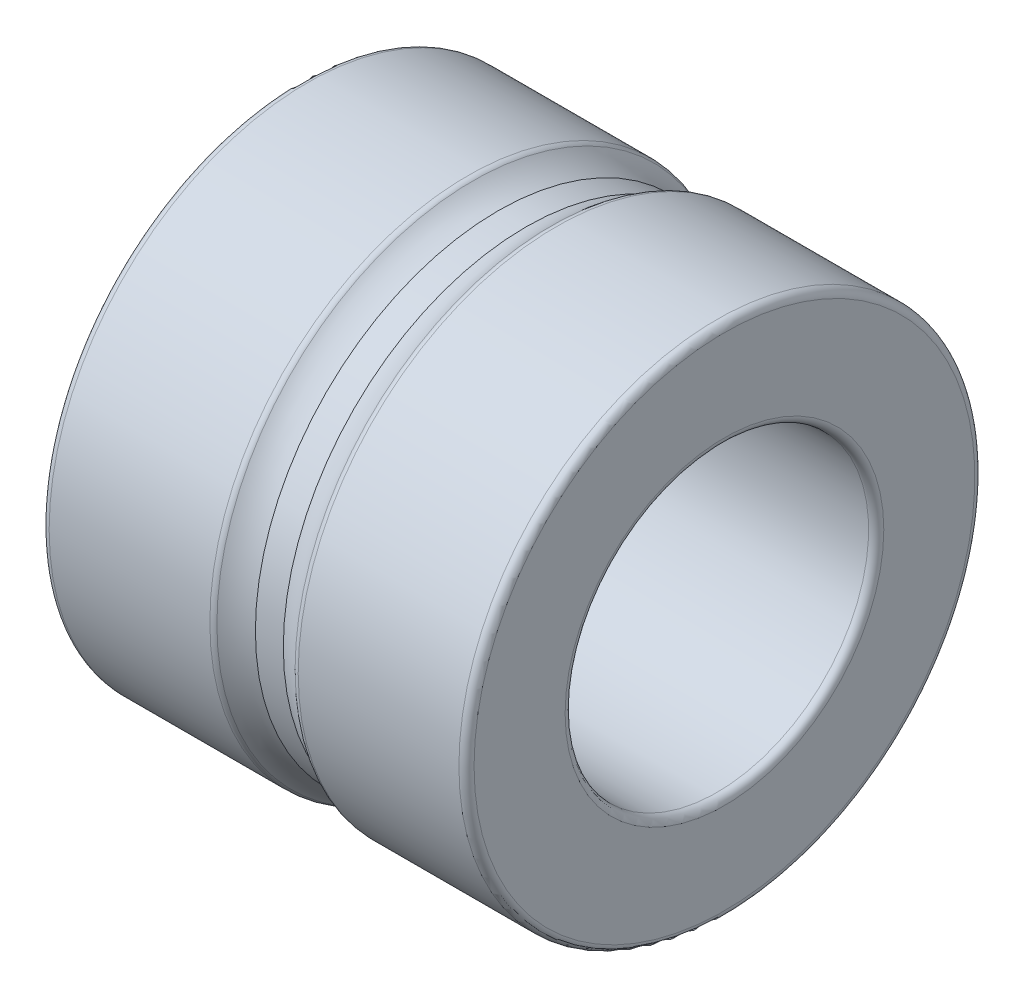
ISO-10303-21;
HEADER;
FILE_DESCRIPTION(('STEP AP214'),'2;1');
FILE_NAME('part.step','',(''),(''),'','','');
FILE_SCHEMA(('AUTOMOTIVE_DESIGN { 1 0 10303 214 1 1 1 1 }'));
ENDSEC;
DATA;
#1=APPLICATION_CONTEXT('core data for automotive mechanical design processes');
#2=APPLICATION_PROTOCOL_DEFINITION('international standard','automotive_design',2000,#1);
#3=PRODUCT_CONTEXT('',#1,'mechanical');
#4=PRODUCT('Part','Part','',(#3));
#5=PRODUCT_RELATED_PRODUCT_CATEGORY('part','',(#4));
#6=PRODUCT_DEFINITION_FORMATION('','',#4);
#7=PRODUCT_DEFINITION_CONTEXT('part definition',#1,'design');
#8=PRODUCT_DEFINITION('design','',#6,#7);
#9=PRODUCT_DEFINITION_SHAPE('','',#8);
#10=(LENGTH_UNIT() NAMED_UNIT(*) SI_UNIT(.MILLI.,.METRE.));
#11=(NAMED_UNIT(*) PLANE_ANGLE_UNIT() SI_UNIT($,.RADIAN.));
#12=(NAMED_UNIT(*) SI_UNIT($,.STERADIAN.) SOLID_ANGLE_UNIT());
#13=UNCERTAINTY_MEASURE_WITH_UNIT(LENGTH_MEASURE(1.E-05),#10,'distance_accuracy_value','');
#14=(GEOMETRIC_REPRESENTATION_CONTEXT(3) GLOBAL_UNCERTAINTY_ASSIGNED_CONTEXT((#13)) GLOBAL_UNIT_ASSIGNED_CONTEXT((#10,
#11,#12)) REPRESENTATION_CONTEXT('',''));
#15=CARTESIAN_POINT('',(0.,0.,0.));
#16=DIRECTION('',(0.,0.,1.));
#17=DIRECTION('',(1.,0.,0.));
#18=AXIS2_PLACEMENT_3D('',#15,#16,#17);
#19=CARTESIAN_POINT('',(0.,5.,0.));
#20=DIRECTION('',(1.,0.,0.));
#21=DIRECTION('',(0.,0.,-1.));
#22=AXIS2_PLACEMENT_3D('',#19,#20,#21);
#23=PLANE('',#22);
#24=CARTESIAN_POINT('',(0.,0.,0.));
#25=DIRECTION('',(1.,0.,0.));
#26=DIRECTION('',(0.,0.,-1.));
#27=AXIS2_PLACEMENT_3D('',#24,#25,#26);
#28=CIRCLE('',#27,5.25);
#29=CARTESIAN_POINT('',(0.,0.,-5.25));
#30=VERTEX_POINT('',#29);
#31=EDGE_CURVE('E49',#30,#30,#28,.T.);
#32=ORIENTED_EDGE('',*,*,#31,.T.);
#33=EDGE_LOOP('',(#32));
#34=FACE_BOUND('',#33,.T.);
#35=CARTESIAN_POINT('',(0.,0.,0.));
#36=DIRECTION('',(1.,0.,0.));
#37=DIRECTION('',(0.,0.,-1.));
#38=AXIS2_PLACEMENT_3D('',#35,#36,#37);
#39=CIRCLE('',#38,8.25);
#40=CARTESIAN_POINT('',(0.,0.,-8.25));
#41=VERTEX_POINT('',#40);
#42=EDGE_CURVE('E54',#41,#41,#39,.F.);
#43=ORIENTED_EDGE('',*,*,#42,.T.);
#44=EDGE_LOOP('',(#43));
#45=FACE_BOUND('',#44,.T.);
#46=ADVANCED_FACE('F36',(#34,#45),#23,.F.);
#47=CARTESIAN_POINT('',(0.,0.,0.));
#48=DIRECTION('',(-1.,0.,0.));
#49=DIRECTION('',(0.,0.,1.));
#50=AXIS2_PLACEMENT_3D('',#47,#48,#49);
#51=CYLINDRICAL_SURFACE('',#50,5.);
#52=CARTESIAN_POINT('',(0.25,0.,0.));
#53=DIRECTION('',(1.,0.,0.));
#54=DIRECTION('',(0.,0.,-1.));
#55=AXIS2_PLACEMENT_3D('',#52,#53,#54);
#56=CIRCLE('',#55,5.);
#57=CARTESIAN_POINT('',(0.25,0.,-5.));
#58=VERTEX_POINT('',#57);
#59=EDGE_CURVE('E60',#58,#58,#56,.F.);
#60=ORIENTED_EDGE('',*,*,#59,.T.);
#61=EDGE_LOOP('',(#60));
#62=FACE_BOUND('',#61,.T.);
#63=CARTESIAN_POINT('',(13.75,0.,0.));
#64=DIRECTION('',(-1.,0.,0.));
#65=DIRECTION('',(0.,0.,1.));
#66=AXIS2_PLACEMENT_3D('',#63,#64,#65);
#67=CIRCLE('',#66,5.);
#68=CARTESIAN_POINT('',(13.75,0.,5.));
#69=VERTEX_POINT('',#68);
#70=EDGE_CURVE('E64',#69,#69,#67,.F.);
#71=ORIENTED_EDGE('',*,*,#70,.T.);
#72=EDGE_LOOP('',(#71));
#73=FACE_BOUND('',#72,.T.);
#74=ADVANCED_FACE('F121',(#62,#73),#51,.F.);
#75=CARTESIAN_POINT('',(14.,5.,0.));
#76=DIRECTION('',(-1.,0.,0.));
#77=DIRECTION('',(0.,0.,1.));
#78=AXIS2_PLACEMENT_3D('',#75,#76,#77);
#79=PLANE('',#78);
#80=CARTESIAN_POINT('',(14.,0.,0.));
#81=DIRECTION('',(-1.,0.,0.));
#82=DIRECTION('',(0.,0.,1.));
#83=AXIS2_PLACEMENT_3D('',#80,#81,#82);
#84=CIRCLE('',#83,5.25);
#85=CARTESIAN_POINT('',(14.,0.,5.25));
#86=VERTEX_POINT('',#85);
#87=EDGE_CURVE('E10',#86,#86,#84,.T.);
#88=ORIENTED_EDGE('',*,*,#87,.T.);
#89=EDGE_LOOP('',(#88));
#90=FACE_BOUND('',#89,.T.);
#91=CARTESIAN_POINT('',(14.,0.,0.));
#92=DIRECTION('',(-1.,0.,0.));
#93=DIRECTION('',(0.,0.,1.));
#94=AXIS2_PLACEMENT_3D('',#91,#92,#93);
#95=CIRCLE('',#94,8.25);
#96=CARTESIAN_POINT('',(14.,0.,8.25));
#97=VERTEX_POINT('',#96);
#98=EDGE_CURVE('E44',#97,#97,#95,.F.);
#99=ORIENTED_EDGE('',*,*,#98,.T.);
#100=EDGE_LOOP('',(#99));
#101=FACE_BOUND('',#100,.T.);
#102=ADVANCED_FACE('F117',(#90,#101),#79,.F.);
#103=CARTESIAN_POINT('',(0.,0.,0.));
#104=DIRECTION('',(-1.,0.,0.));
#105=DIRECTION('',(0.,0.,1.));
#106=AXIS2_PLACEMENT_3D('',#103,#104,#105);
#107=CYLINDRICAL_SURFACE('',#106,8.5);
#108=CARTESIAN_POINT('',(8.45593838711437,0.,0.));
#109=DIRECTION('',(1.,0.,0.));
#110=DIRECTION('',(0.,0.,-1.));
#111=AXIS2_PLACEMENT_3D('',#108,#109,#110);
#112=CIRCLE('',#111,8.5);
#113=CARTESIAN_POINT('',(8.45593838711437,0.,-8.5));
#114=VERTEX_POINT('',#113);
#115=EDGE_CURVE('E68',#114,#114,#112,.T.);
#116=ORIENTED_EDGE('',*,*,#115,.T.);
#117=EDGE_LOOP('',(#116));
#118=FACE_BOUND('',#117,.T.);
#119=CARTESIAN_POINT('',(13.75,0.,0.));
#120=DIRECTION('',(-1.,0.,0.));
#121=DIRECTION('',(0.,0.,1.));
#122=AXIS2_PLACEMENT_3D('',#119,#120,#121);
#123=CIRCLE('',#122,8.5);
#124=CARTESIAN_POINT('',(13.75,0.,8.5));
#125=VERTEX_POINT('',#124);
#126=EDGE_CURVE('E72',#125,#125,#123,.T.);
#127=ORIENTED_EDGE('',*,*,#126,.T.);
#128=EDGE_LOOP('',(#127));
#129=FACE_BOUND('',#128,.T.);
#130=ADVANCED_FACE('F111',(#118,#129),#107,.T.);
#131=CARTESIAN_POINT('',(7.,0.,0.));
#132=DIRECTION('',(-1.,0.,0.));
#133=DIRECTION('',(0.,0.,1.));
#134=AXIS2_PLACEMENT_3D('',#131,#132,#133);
#135=TOROIDAL_SURFACE('',#134,9.85908154328076,1.92);
#136=CARTESIAN_POINT('',(8.28820354988921,0.,0.));
#137=DIRECTION('',(-1.,0.,0.));
#138=DIRECTION('',(0.,0.,1.));
#139=AXIS2_PLACEMENT_3D('',#136,#137,#138);
#140=CIRCLE('',#139,8.43537805798166);
#141=CARTESIAN_POINT('',(8.28820354988921,0.,8.43537805798166));
#142=VERTEX_POINT('',#141);
#143=EDGE_CURVE('E76',#142,#142,#140,.T.);
#144=ORIENTED_EDGE('',*,*,#143,.T.);
#145=EDGE_LOOP('',(#144));
#146=FACE_BOUND('',#145,.T.);
#147=CARTESIAN_POINT('',(7.46,0.,0.));
#148=DIRECTION('',(-1.,0.,0.));
#149=DIRECTION('',(0.,0.,1.));
#150=AXIS2_PLACEMENT_3D('',#147,#148,#149);
#151=CIRCLE('',#150,7.995);
#152=CARTESIAN_POINT('',(7.46,0.,7.995));
#153=VERTEX_POINT('',#152);
#154=EDGE_CURVE('E92',#153,#153,#151,.T.);
#155=ORIENTED_EDGE('',*,*,#154,.F.);
#156=EDGE_LOOP('',(#155));
#157=FACE_BOUND('',#156,.T.);
#158=ADVANCED_FACE('F106',(#146,#157),#135,.F.);
#159=CARTESIAN_POINT('',(0.,0.,0.));
#160=DIRECTION('',(-1.,0.,0.));
#161=DIRECTION('',(0.,0.,1.));
#162=AXIS2_PLACEMENT_3D('',#159,#160,#161);
#163=CYLINDRICAL_SURFACE('',#162,7.995);
#164=CARTESIAN_POINT('',(6.54,0.,0.));
#165=DIRECTION('',(-1.,0.,0.));
#166=DIRECTION('',(0.,0.,1.));
#167=AXIS2_PLACEMENT_3D('',#164,#165,#166);
#168=CIRCLE('',#167,7.995);
#169=CARTESIAN_POINT('',(6.54,0.,7.995));
#170=VERTEX_POINT('',#169);
#171=EDGE_CURVE('E96',#170,#170,#168,.T.);
#172=ORIENTED_EDGE('',*,*,#171,.F.);
#173=EDGE_LOOP('',(#172));
#174=FACE_BOUND('',#173,.T.);
#175=ORIENTED_EDGE('',*,*,#154,.T.);
#176=EDGE_LOOP('',(#175));
#177=FACE_BOUND('',#176,.T.);
#178=ADVANCED_FACE('F103',(#174,#177),#163,.T.);
#179=CARTESIAN_POINT('',(7.,0.,0.));
#180=DIRECTION('',(-1.,0.,0.));
#181=DIRECTION('',(0.,0.,1.));
#182=AXIS2_PLACEMENT_3D('',#179,#180,#181);
#183=TOROIDAL_SURFACE('',#182,9.85908154328076,1.92);
#184=CARTESIAN_POINT('',(5.71179645011079,0.,0.));
#185=DIRECTION('',(1.,0.,0.));
#186=DIRECTION('',(0.,0.,-1.));
#187=AXIS2_PLACEMENT_3D('',#184,#185,#186);
#188=CIRCLE('',#187,8.43537805798166);
#189=CARTESIAN_POINT('',(5.71179645011079,0.,-8.43537805798166));
#190=VERTEX_POINT('',#189);
#191=EDGE_CURVE('E80',#190,#190,#188,.T.);
#192=ORIENTED_EDGE('',*,*,#191,.T.);
#193=EDGE_LOOP('',(#192));
#194=FACE_BOUND('',#193,.T.);
#195=ORIENTED_EDGE('',*,*,#171,.T.);
#196=EDGE_LOOP('',(#195));
#197=FACE_BOUND('',#196,.T.);
#198=ADVANCED_FACE('F101',(#194,#197),#183,.F.);
#199=CARTESIAN_POINT('',(0.,0.,0.));
#200=DIRECTION('',(-1.,0.,0.));
#201=DIRECTION('',(0.,0.,1.));
#202=AXIS2_PLACEMENT_3D('',#199,#200,#201);
#203=CYLINDRICAL_SURFACE('',#202,8.5);
#204=CARTESIAN_POINT('',(5.54406161288563,0.,0.));
#205=DIRECTION('',(1.,0.,0.));
#206=DIRECTION('',(0.,0.,-1.));
#207=AXIS2_PLACEMENT_3D('',#204,#205,#206);
#208=CIRCLE('',#207,8.5);
#209=CARTESIAN_POINT('',(5.54406161288563,0.,-8.5));
#210=VERTEX_POINT('',#209);
#211=EDGE_CURVE('E84',#210,#210,#208,.F.);
#212=ORIENTED_EDGE('',*,*,#211,.T.);
#213=EDGE_LOOP('',(#212));
#214=FACE_BOUND('',#213,.T.);
#215=CARTESIAN_POINT('',(0.25,0.,0.));
#216=DIRECTION('',(1.,0.,0.));
#217=DIRECTION('',(0.,0.,-1.));
#218=AXIS2_PLACEMENT_3D('',#215,#216,#217);
#219=CIRCLE('',#218,8.5);
#220=CARTESIAN_POINT('',(0.25,0.,-8.5));
#221=VERTEX_POINT('',#220);
#222=EDGE_CURVE('E88',#221,#221,#219,.T.);
#223=ORIENTED_EDGE('',*,*,#222,.T.);
#224=EDGE_LOOP('',(#223));
#225=FACE_BOUND('',#224,.T.);
#226=ADVANCED_FACE('F136',(#214,#225),#203,.T.);
#227=CARTESIAN_POINT('',(5.54406161288563,0.,0.));
#228=DIRECTION('',(1.,0.,0.));
#229=DIRECTION('',(0.,0.,-1.));
#230=AXIS2_PLACEMENT_3D('',#227,#228,#229);
#231=TOROIDAL_SURFACE('',#230,8.25,0.25);
#232=ORIENTED_EDGE('',*,*,#191,.F.);
#233=EDGE_LOOP('',(#232));
#234=FACE_BOUND('',#233,.T.);
#235=ORIENTED_EDGE('',*,*,#211,.F.);
#236=EDGE_LOOP('',(#235));
#237=FACE_BOUND('',#236,.T.);
#238=ADVANCED_FACE('F132',(#234,#237),#231,.T.);
#239=CARTESIAN_POINT('',(8.45593838711437,0.,0.));
#240=DIRECTION('',(1.,0.,0.));
#241=DIRECTION('',(0.,0.,-1.));
#242=AXIS2_PLACEMENT_3D('',#239,#240,#241);
#243=TOROIDAL_SURFACE('',#242,8.25,0.25);
#244=ORIENTED_EDGE('',*,*,#115,.F.);
#245=EDGE_LOOP('',(#244));
#246=FACE_BOUND('',#245,.T.);
#247=ORIENTED_EDGE('',*,*,#143,.F.);
#248=EDGE_LOOP('',(#247));
#249=FACE_BOUND('',#248,.T.);
#250=ADVANCED_FACE('F135',(#246,#249),#243,.T.);
#251=CARTESIAN_POINT('',(0.25,0.,0.));
#252=DIRECTION('',(1.,0.,0.));
#253=DIRECTION('',(0.,0.,-1.));
#254=AXIS2_PLACEMENT_3D('',#251,#252,#253);
#255=TOROIDAL_SURFACE('',#254,5.25,0.25);
#256=ORIENTED_EDGE('',*,*,#31,.F.);
#257=EDGE_LOOP('',(#256));
#258=FACE_BOUND('',#257,.T.);
#259=ORIENTED_EDGE('',*,*,#59,.F.);
#260=EDGE_LOOP('',(#259));
#261=FACE_BOUND('',#260,.T.);
#262=ADVANCED_FACE('F140',(#258,#261),#255,.T.);
#263=CARTESIAN_POINT('',(13.75,0.,0.));
#264=DIRECTION('',(-1.,0.,0.));
#265=DIRECTION('',(0.,0.,1.));
#266=AXIS2_PLACEMENT_3D('',#263,#264,#265);
#267=TOROIDAL_SURFACE('',#266,5.25,0.25);
#268=ORIENTED_EDGE('',*,*,#70,.F.);
#269=EDGE_LOOP('',(#268));
#270=FACE_BOUND('',#269,.T.);
#271=ORIENTED_EDGE('',*,*,#87,.F.);
#272=EDGE_LOOP('',(#271));
#273=FACE_BOUND('',#272,.T.);
#274=ADVANCED_FACE('F144',(#270,#273),#267,.T.);
#275=CARTESIAN_POINT('',(0.25,0.,0.));
#276=DIRECTION('',(1.,0.,0.));
#277=DIRECTION('',(0.,0.,-1.));
#278=AXIS2_PLACEMENT_3D('',#275,#276,#277);
#279=TOROIDAL_SURFACE('',#278,8.25,0.25);
#280=ORIENTED_EDGE('',*,*,#222,.F.);
#281=EDGE_LOOP('',(#280));
#282=FACE_BOUND('',#281,.T.);
#283=ORIENTED_EDGE('',*,*,#42,.F.);
#284=EDGE_LOOP('',(#283));
#285=FACE_BOUND('',#284,.T.);
#286=ADVANCED_FACE('F147',(#282,#285),#279,.T.);
#287=CARTESIAN_POINT('',(13.75,0.,0.));
#288=DIRECTION('',(-1.,0.,0.));
#289=DIRECTION('',(0.,0.,1.));
#290=AXIS2_PLACEMENT_3D('',#287,#288,#289);
#291=TOROIDAL_SURFACE('',#290,8.25,0.25);
#292=ORIENTED_EDGE('',*,*,#98,.F.);
#293=EDGE_LOOP('',(#292));
#294=FACE_BOUND('',#293,.T.);
#295=ORIENTED_EDGE('',*,*,#126,.F.);
#296=EDGE_LOOP('',(#295));
#297=FACE_BOUND('',#296,.T.);
#298=ADVANCED_FACE('F38',(#294,#297),#291,.T.);
#299=CLOSED_SHELL('',(#46,#74,#102,#130,#158,#178,#198,#226,#238,#250,#262,#274,#286,#298));
#300=MANIFOLD_SOLID_BREP('B2',#299);
#301=ADVANCED_BREP_SHAPE_REPRESENTATION('',(#18,#300),#14);
#302=SHAPE_DEFINITION_REPRESENTATION(#9,#301);
ENDSEC;
END-ISO-10303-21;
